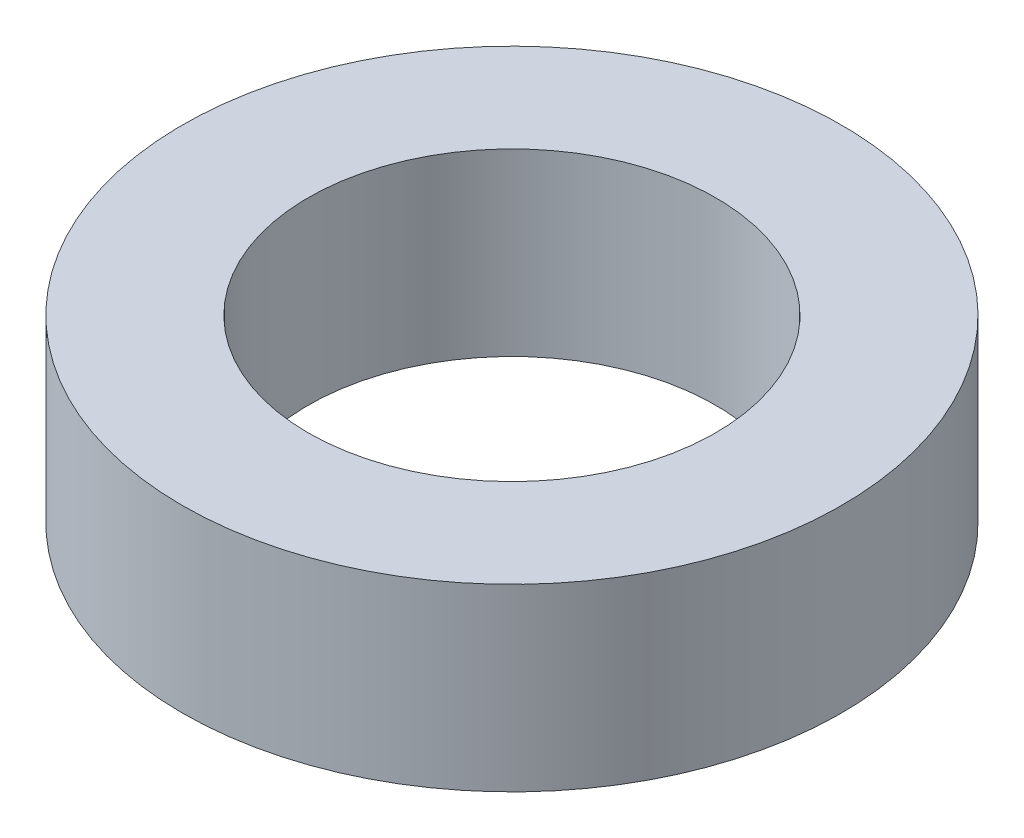
ISO-10303-21;
HEADER;
FILE_DESCRIPTION(('STEP AP214'),'2;1');
FILE_NAME('part.step','',(''),(''),'','','');
FILE_SCHEMA(('AUTOMOTIVE_DESIGN { 1 0 10303 214 1 1 1 1 }'));
ENDSEC;
DATA;
#1=APPLICATION_CONTEXT('core data for automotive mechanical design processes');
#2=APPLICATION_PROTOCOL_DEFINITION('international standard','automotive_design',2000,#1);
#3=PRODUCT_CONTEXT('',#1,'mechanical');
#4=PRODUCT('Part','Part','',(#3));
#5=PRODUCT_RELATED_PRODUCT_CATEGORY('part','',(#4));
#6=PRODUCT_DEFINITION_FORMATION('','',#4);
#7=PRODUCT_DEFINITION_CONTEXT('part definition',#1,'design');
#8=PRODUCT_DEFINITION('design','',#6,#7);
#9=PRODUCT_DEFINITION_SHAPE('','',#8);
#10=(LENGTH_UNIT() NAMED_UNIT(*) SI_UNIT(.MILLI.,.METRE.));
#11=(NAMED_UNIT(*) PLANE_ANGLE_UNIT() SI_UNIT($,.RADIAN.));
#12=(NAMED_UNIT(*) SI_UNIT($,.STERADIAN.) SOLID_ANGLE_UNIT());
#13=UNCERTAINTY_MEASURE_WITH_UNIT(LENGTH_MEASURE(1.E-05),#10,'distance_accuracy_value','');
#14=(GEOMETRIC_REPRESENTATION_CONTEXT(3) GLOBAL_UNCERTAINTY_ASSIGNED_CONTEXT((#13)) GLOBAL_UNIT_ASSIGNED_CONTEXT((#10,
#11,#12)) REPRESENTATION_CONTEXT('',''));
#15=CARTESIAN_POINT('',(0.,0.,0.));
#16=DIRECTION('',(0.,0.,1.));
#17=DIRECTION('',(1.,0.,0.));
#18=AXIS2_PLACEMENT_3D('',#15,#16,#17);
#19=CARTESIAN_POINT('',(0.,1.5,0.));
#20=DIRECTION('',(0.,1.,0.));
#21=DIRECTION('',(0.,0.,1.));
#22=AXIS2_PLACEMENT_3D('',#19,#20,#21);
#23=PLANE('',#22);
#24=CARTESIAN_POINT('',(0.,1.5,0.));
#25=DIRECTION('',(0.,1.,0.));
#26=DIRECTION('',(0.,0.,1.));
#27=AXIS2_PLACEMENT_3D('',#24,#25,#26);
#28=CIRCLE('',#27,2.75);
#29=CARTESIAN_POINT('',(0.,1.5,2.75));
#30=VERTEX_POINT('',#29);
#31=EDGE_CURVE('E10',#30,#30,#28,.T.);
#32=ORIENTED_EDGE('',*,*,#31,.T.);
#33=EDGE_LOOP('',(#32));
#34=FACE_BOUND('',#33,.T.);
#35=CARTESIAN_POINT('',(0.,1.5,0.));
#36=DIRECTION('',(0.,1.,0.));
#37=DIRECTION('',(0.,0.,1.));
#38=AXIS2_PLACEMENT_3D('',#35,#36,#37);
#39=CIRCLE('',#38,1.7);
#40=CARTESIAN_POINT('',(0.,1.5,1.7));
#41=VERTEX_POINT('',#40);
#42=EDGE_CURVE('E50',#41,#41,#39,.T.);
#43=ORIENTED_EDGE('',*,*,#42,.F.);
#44=EDGE_LOOP('',(#43));
#45=FACE_BOUND('',#44,.T.);
#46=ADVANCED_FACE('F37',(#34,#45),#23,.T.);
#47=CARTESIAN_POINT('',(0.,0.,0.));
#48=DIRECTION('',(0.,1.,0.));
#49=DIRECTION('',(0.,0.,1.));
#50=AXIS2_PLACEMENT_3D('',#47,#48,#49);
#51=PLANE('',#50);
#52=CARTESIAN_POINT('',(0.,0.,0.));
#53=DIRECTION('',(0.,1.,0.));
#54=DIRECTION('',(0.,0.,1.));
#55=AXIS2_PLACEMENT_3D('',#52,#53,#54);
#56=CIRCLE('',#55,2.75);
#57=CARTESIAN_POINT('',(0.,0.,2.75));
#58=VERTEX_POINT('',#57);
#59=EDGE_CURVE('E41',#58,#58,#56,.T.);
#60=ORIENTED_EDGE('',*,*,#59,.F.);
#61=EDGE_LOOP('',(#60));
#62=FACE_BOUND('',#61,.T.);
#63=CARTESIAN_POINT('',(0.,0.,0.));
#64=DIRECTION('',(0.,1.,0.));
#65=DIRECTION('',(0.,0.,1.));
#66=AXIS2_PLACEMENT_3D('',#63,#64,#65);
#67=CIRCLE('',#66,1.7);
#68=CARTESIAN_POINT('',(0.,0.,1.7));
#69=VERTEX_POINT('',#68);
#70=EDGE_CURVE('E52',#69,#69,#67,.T.);
#71=ORIENTED_EDGE('',*,*,#70,.T.);
#72=EDGE_LOOP('',(#71));
#73=FACE_BOUND('',#72,.T.);
#74=ADVANCED_FACE('F64',(#62,#73),#51,.F.);
#75=CARTESIAN_POINT('',(0.,1.5,0.));
#76=DIRECTION('',(0.,-1.,0.));
#77=DIRECTION('',(0.,0.,-1.));
#78=AXIS2_PLACEMENT_3D('',#75,#76,#77);
#79=CYLINDRICAL_SURFACE('',#78,2.75);
#80=ORIENTED_EDGE('',*,*,#31,.F.);
#81=EDGE_LOOP('',(#80));
#82=FACE_BOUND('',#81,.T.);
#83=ORIENTED_EDGE('',*,*,#59,.T.);
#84=EDGE_LOOP('',(#83));
#85=FACE_BOUND('',#84,.T.);
#86=ADVANCED_FACE('F39',(#82,#85),#79,.T.);
#87=CARTESIAN_POINT('',(0.,1.5,0.));
#88=DIRECTION('',(0.,-1.,0.));
#89=DIRECTION('',(0.,0.,-1.));
#90=AXIS2_PLACEMENT_3D('',#87,#88,#89);
#91=CYLINDRICAL_SURFACE('',#90,1.7);
#92=ORIENTED_EDGE('',*,*,#42,.T.);
#93=EDGE_LOOP('',(#92));
#94=FACE_BOUND('',#93,.T.);
#95=ORIENTED_EDGE('',*,*,#70,.F.);
#96=EDGE_LOOP('',(#95));
#97=FACE_BOUND('',#96,.T.);
#98=ADVANCED_FACE('F60',(#94,#97),#91,.F.);
#99=CLOSED_SHELL('',(#46,#74,#86,#98));
#100=MANIFOLD_SOLID_BREP('B2',#99);
#101=ADVANCED_BREP_SHAPE_REPRESENTATION('',(#18,#100),#14);
#102=SHAPE_DEFINITION_REPRESENTATION(#9,#101);
ENDSEC;
END-ISO-10303-21;
